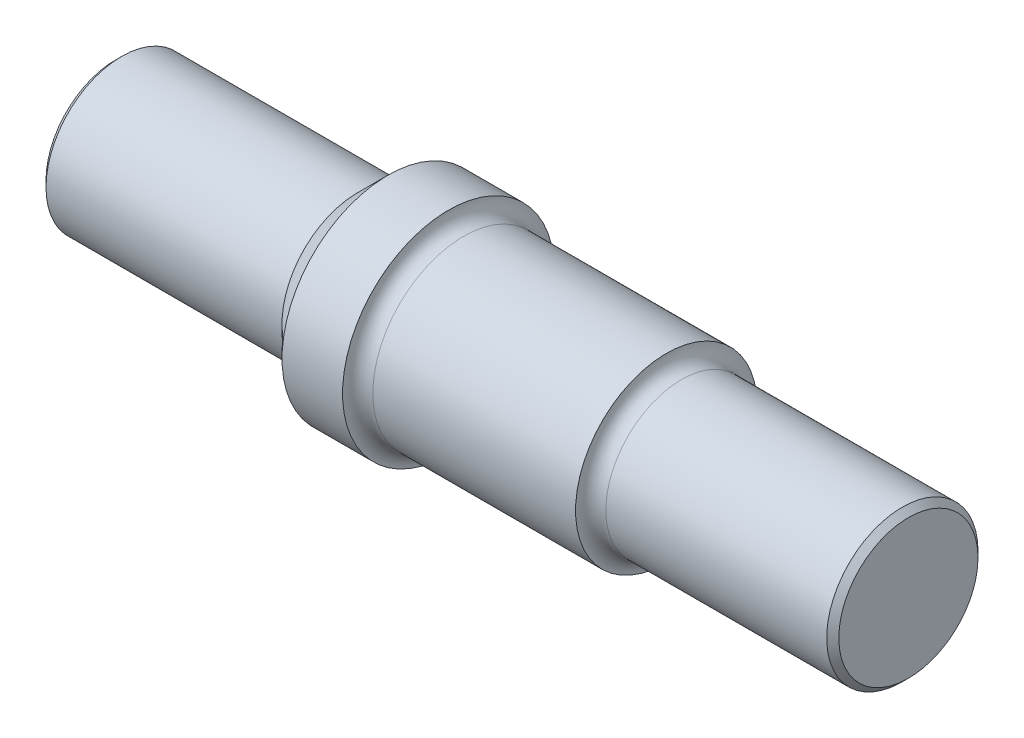
ISO-10303-21;
HEADER;
FILE_DESCRIPTION(('STEP AP214'),'2;1');
FILE_NAME('part.step','',(''),(''),'','','');
FILE_SCHEMA(('AUTOMOTIVE_DESIGN { 1 0 10303 214 1 1 1 1 }'));
ENDSEC;
DATA;
#1=APPLICATION_CONTEXT('core data for automotive mechanical design processes');
#2=APPLICATION_PROTOCOL_DEFINITION('international standard','automotive_design',2000,#1);
#3=PRODUCT_CONTEXT('',#1,'mechanical');
#4=PRODUCT('Part','Part','',(#3));
#5=PRODUCT_RELATED_PRODUCT_CATEGORY('part','',(#4));
#6=PRODUCT_DEFINITION_FORMATION('','',#4);
#7=PRODUCT_DEFINITION_CONTEXT('part definition',#1,'design');
#8=PRODUCT_DEFINITION('design','',#6,#7);
#9=PRODUCT_DEFINITION_SHAPE('','',#8);
#10=(LENGTH_UNIT() NAMED_UNIT(*) SI_UNIT(.MILLI.,.METRE.));
#11=(NAMED_UNIT(*) PLANE_ANGLE_UNIT() SI_UNIT($,.RADIAN.));
#12=(NAMED_UNIT(*) SI_UNIT($,.STERADIAN.) SOLID_ANGLE_UNIT());
#13=UNCERTAINTY_MEASURE_WITH_UNIT(LENGTH_MEASURE(1.E-05),#10,'distance_accuracy_value','');
#14=(GEOMETRIC_REPRESENTATION_CONTEXT(3) GLOBAL_UNCERTAINTY_ASSIGNED_CONTEXT((#13)) GLOBAL_UNIT_ASSIGNED_CONTEXT((#10,
#11,#12)) REPRESENTATION_CONTEXT('',''));
#15=CARTESIAN_POINT('',(0.,0.,0.));
#16=DIRECTION('',(0.,0.,1.));
#17=DIRECTION('',(1.,0.,0.));
#18=AXIS2_PLACEMENT_3D('',#15,#16,#17);
#19=CARTESIAN_POINT('',(0.,0.,0.));
#20=DIRECTION('',(-1.,0.,0.));
#21=DIRECTION('',(0.,0.,1.));
#22=AXIS2_PLACEMENT_3D('',#19,#20,#21);
#23=PLANE('',#22);
#24=CARTESIAN_POINT('',(0.,0.,0.));
#25=DIRECTION('',(-1.,0.,0.));
#26=DIRECTION('',(0.,0.,1.));
#27=AXIS2_PLACEMENT_3D('',#24,#25,#26);
#28=CIRCLE('',#27,11.5);
#29=CARTESIAN_POINT('',(0.,0.,11.5));
#30=VERTEX_POINT('',#29);
#31=EDGE_CURVE('E10',#30,#30,#28,.T.);
#32=ORIENTED_EDGE('',*,*,#31,.T.);
#33=EDGE_LOOP('',(#32));
#34=FACE_BOUND('',#33,.T.);
#35=ADVANCED_FACE('F30',(#34),#23,.T.);
#36=CARTESIAN_POINT('',(131.,0.,0.));
#37=DIRECTION('',(1.,0.,0.));
#38=DIRECTION('',(0.,0.,-1.));
#39=AXIS2_PLACEMENT_3D('',#36,#37,#38);
#40=CYLINDRICAL_SURFACE('',#39,12.5);
#41=CARTESIAN_POINT('',(0.999999999999973,0.,0.));
#42=DIRECTION('',(-1.,0.,0.));
#43=DIRECTION('',(0.,0.,1.));
#44=AXIS2_PLACEMENT_3D('',#41,#42,#43);
#45=CIRCLE('',#44,12.5);
#46=CARTESIAN_POINT('',(0.999999999999973,0.,12.5));
#47=VERTEX_POINT('',#46);
#48=EDGE_CURVE('E37',#47,#47,#45,.F.);
#49=ORIENTED_EDGE('',*,*,#48,.T.);
#50=EDGE_LOOP('',(#49));
#51=FACE_BOUND('',#50,.T.);
#52=CARTESIAN_POINT('',(40.,0.,0.));
#53=DIRECTION('',(1.,0.,0.));
#54=DIRECTION('',(0.,0.,-1.));
#55=AXIS2_PLACEMENT_3D('',#52,#53,#54);
#56=CIRCLE('',#55,12.5);
#57=CARTESIAN_POINT('',(40.,0.,-12.5));
#58=VERTEX_POINT('',#57);
#59=EDGE_CURVE('E56',#58,#58,#56,.T.);
#60=ORIENTED_EDGE('',*,*,#59,.F.);
#61=EDGE_LOOP('',(#60));
#62=FACE_BOUND('',#61,.T.);
#63=ADVANCED_FACE('F89',(#51,#62),#40,.T.);
#64=CARTESIAN_POINT('',(45.0000000000001,0.,0.));
#65=DIRECTION('',(1.,0.,0.));
#66=DIRECTION('',(0.,0.,-1.));
#67=AXIS2_PLACEMENT_3D('',#64,#65,#66);
#68=CONICAL_SURFACE('',#67,17.5,0.785398163397444);
#69=ORIENTED_EDGE('',*,*,#59,.T.);
#70=EDGE_LOOP('',(#69));
#71=FACE_BOUND('',#70,.T.);
#72=CARTESIAN_POINT('',(45.0000000000001,0.,0.));
#73=DIRECTION('',(1.,0.,0.));
#74=DIRECTION('',(0.,0.,-1.));
#75=AXIS2_PLACEMENT_3D('',#72,#73,#74);
#76=CIRCLE('',#75,17.5);
#77=CARTESIAN_POINT('',(45.0000000000001,0.,-17.5));
#78=VERTEX_POINT('',#77);
#79=EDGE_CURVE('E59',#78,#78,#76,.T.);
#80=ORIENTED_EDGE('',*,*,#79,.F.);
#81=EDGE_LOOP('',(#80));
#82=FACE_BOUND('',#81,.T.);
#83=ADVANCED_FACE('F85',(#71,#82),#68,.T.);
#84=CARTESIAN_POINT('',(131.,0.,0.));
#85=DIRECTION('',(1.,0.,0.));
#86=DIRECTION('',(0.,0.,-1.));
#87=AXIS2_PLACEMENT_3D('',#84,#85,#86);
#88=CYLINDRICAL_SURFACE('',#87,17.5);
#89=ORIENTED_EDGE('',*,*,#79,.T.);
#90=EDGE_LOOP('',(#89));
#91=FACE_BOUND('',#90,.T.);
#92=CARTESIAN_POINT('',(55.,0.,0.));
#93=DIRECTION('',(1.,0.,0.));
#94=DIRECTION('',(0.,0.,-1.));
#95=AXIS2_PLACEMENT_3D('',#92,#93,#94);
#96=CIRCLE('',#95,17.5);
#97=CARTESIAN_POINT('',(55.,0.,-17.5));
#98=VERTEX_POINT('',#97);
#99=EDGE_CURVE('E62',#98,#98,#96,.T.);
#100=ORIENTED_EDGE('',*,*,#99,.F.);
#101=EDGE_LOOP('',(#100));
#102=FACE_BOUND('',#101,.T.);
#103=ADVANCED_FACE('F75',(#91,#102),#88,.T.);
#104=CARTESIAN_POINT('',(131.,0.,0.));
#105=DIRECTION('',(1.,0.,0.));
#106=DIRECTION('',(0.,0.,-1.));
#107=AXIS2_PLACEMENT_3D('',#104,#105,#106);
#108=CYLINDRICAL_SURFACE('',#107,15.);
#109=CARTESIAN_POINT('',(57.5,0.,0.));
#110=DIRECTION('',(1.,0.,0.));
#111=DIRECTION('',(0.,0.,-1.));
#112=AXIS2_PLACEMENT_3D('',#109,#110,#111);
#113=CIRCLE('',#112,15.);
#114=CARTESIAN_POINT('',(57.5,0.,-15.));
#115=VERTEX_POINT('',#114);
#116=EDGE_CURVE('E50',#115,#115,#113,.T.);
#117=ORIENTED_EDGE('',*,*,#116,.T.);
#118=EDGE_LOOP('',(#117));
#119=FACE_BOUND('',#118,.T.);
#120=CARTESIAN_POINT('',(91.0000000000001,0.,0.));
#121=DIRECTION('',(1.,0.,0.));
#122=DIRECTION('',(0.,0.,-1.));
#123=AXIS2_PLACEMENT_3D('',#120,#121,#122);
#124=CIRCLE('',#123,15.);
#125=CARTESIAN_POINT('',(91.0000000000001,0.,-15.));
#126=VERTEX_POINT('',#125);
#127=EDGE_CURVE('E65',#126,#126,#124,.T.);
#128=ORIENTED_EDGE('',*,*,#127,.F.);
#129=EDGE_LOOP('',(#128));
#130=FACE_BOUND('',#129,.T.);
#131=ADVANCED_FACE('F72',(#119,#130),#108,.T.);
#132=CARTESIAN_POINT('',(131.,0.,0.));
#133=DIRECTION('',(1.,0.,0.));
#134=DIRECTION('',(0.,0.,-1.));
#135=AXIS2_PLACEMENT_3D('',#132,#133,#134);
#136=CYLINDRICAL_SURFACE('',#135,12.5);
#137=CARTESIAN_POINT('',(130.,0.,0.));
#138=DIRECTION('',(1.,0.,0.));
#139=DIRECTION('',(0.,0.,-1.));
#140=AXIS2_PLACEMENT_3D('',#137,#138,#139);
#141=CIRCLE('',#140,12.5);
#142=CARTESIAN_POINT('',(130.,0.,-12.5));
#143=VERTEX_POINT('',#142);
#144=EDGE_CURVE('E41',#143,#143,#141,.F.);
#145=ORIENTED_EDGE('',*,*,#144,.T.);
#146=EDGE_LOOP('',(#145));
#147=FACE_BOUND('',#146,.T.);
#148=CARTESIAN_POINT('',(93.5000000000001,0.,0.));
#149=DIRECTION('',(1.,0.,0.));
#150=DIRECTION('',(0.,0.,-1.));
#151=AXIS2_PLACEMENT_3D('',#148,#149,#150);
#152=CIRCLE('',#151,12.5);
#153=CARTESIAN_POINT('',(93.5000000000001,0.,-12.5));
#154=VERTEX_POINT('',#153);
#155=EDGE_CURVE('E53',#154,#154,#152,.T.);
#156=ORIENTED_EDGE('',*,*,#155,.T.);
#157=EDGE_LOOP('',(#156));
#158=FACE_BOUND('',#157,.T.);
#159=ADVANCED_FACE('F74',(#147,#158),#136,.T.);
#160=CARTESIAN_POINT('',(131.,12.5,0.));
#161=DIRECTION('',(1.,0.,0.));
#162=DIRECTION('',(0.,0.,-1.));
#163=AXIS2_PLACEMENT_3D('',#160,#161,#162);
#164=PLANE('',#163);
#165=CARTESIAN_POINT('',(131.,0.,0.));
#166=DIRECTION('',(1.,0.,0.));
#167=DIRECTION('',(0.,0.,-1.));
#168=AXIS2_PLACEMENT_3D('',#165,#166,#167);
#169=CIRCLE('',#168,11.5);
#170=CARTESIAN_POINT('',(131.,0.,-11.5));
#171=VERTEX_POINT('',#170);
#172=EDGE_CURVE('E45',#171,#171,#169,.T.);
#173=ORIENTED_EDGE('',*,*,#172,.T.);
#174=EDGE_LOOP('',(#173));
#175=FACE_BOUND('',#174,.T.);
#176=ADVANCED_FACE('F82',(#175),#164,.T.);
#177=CARTESIAN_POINT('',(93.5000000000001,0.,0.));
#178=DIRECTION('',(1.,0.,0.));
#179=DIRECTION('',(0.,0.,-1.));
#180=AXIS2_PLACEMENT_3D('',#177,#178,#179);
#181=TOROIDAL_SURFACE('',#180,15.,2.5);
#182=ORIENTED_EDGE('',*,*,#127,.T.);
#183=EDGE_LOOP('',(#182));
#184=FACE_BOUND('',#183,.T.);
#185=ORIENTED_EDGE('',*,*,#155,.F.);
#186=EDGE_LOOP('',(#185));
#187=FACE_BOUND('',#186,.T.);
#188=ADVANCED_FACE('F69',(#184,#187),#181,.F.);
#189=CARTESIAN_POINT('',(57.5,0.,0.));
#190=DIRECTION('',(1.,0.,0.));
#191=DIRECTION('',(0.,0.,-1.));
#192=AXIS2_PLACEMENT_3D('',#189,#190,#191);
#193=TOROIDAL_SURFACE('',#192,17.5,2.5);
#194=ORIENTED_EDGE('',*,*,#99,.T.);
#195=EDGE_LOOP('',(#194));
#196=FACE_BOUND('',#195,.T.);
#197=ORIENTED_EDGE('',*,*,#116,.F.);
#198=EDGE_LOOP('',(#197));
#199=FACE_BOUND('',#198,.T.);
#200=ADVANCED_FACE('F99',(#196,#199),#193,.F.);
#201=CARTESIAN_POINT('',(131.,0.,0.));
#202=DIRECTION('',(-1.,0.,0.));
#203=DIRECTION('',(0.,0.,1.));
#204=AXIS2_PLACEMENT_3D('',#201,#202,#203);
#205=CONICAL_SURFACE('',#204,11.5,0.78539816339745);
#206=ORIENTED_EDGE('',*,*,#144,.F.);
#207=EDGE_LOOP('',(#206));
#208=FACE_BOUND('',#207,.T.);
#209=ORIENTED_EDGE('',*,*,#172,.F.);
#210=EDGE_LOOP('',(#209));
#211=FACE_BOUND('',#210,.T.);
#212=ADVANCED_FACE('F101',(#208,#211),#205,.T.);
#213=CARTESIAN_POINT('',(0.999999999999973,0.,0.));
#214=DIRECTION('',(1.,0.,0.));
#215=DIRECTION('',(0.,0.,-1.));
#216=AXIS2_PLACEMENT_3D('',#213,#214,#215);
#217=CONICAL_SURFACE('',#216,12.5,0.785398163397458);
#218=ORIENTED_EDGE('',*,*,#31,.F.);
#219=EDGE_LOOP('',(#218));
#220=FACE_BOUND('',#219,.T.);
#221=ORIENTED_EDGE('',*,*,#48,.F.);
#222=EDGE_LOOP('',(#221));
#223=FACE_BOUND('',#222,.T.);
#224=ADVANCED_FACE('F32',(#220,#223),#217,.T.);
#225=CLOSED_SHELL('',(#35,#63,#83,#103,#131,#159,#176,#188,#200,#212,#224));
#226=MANIFOLD_SOLID_BREP('B2',#225);
#227=ADVANCED_BREP_SHAPE_REPRESENTATION('',(#18,#226),#14);
#228=SHAPE_DEFINITION_REPRESENTATION(#9,#227);
ENDSEC;
END-ISO-10303-21;
